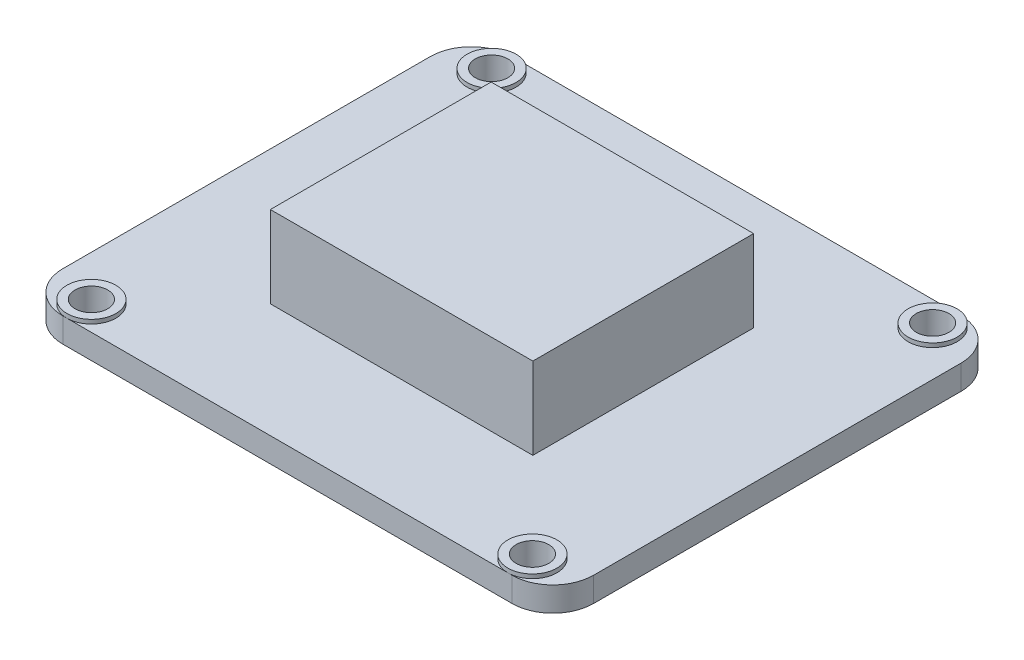
ISO-10303-21;
HEADER;
FILE_DESCRIPTION(('STEP AP214'),'2;1');
FILE_NAME('part.step','',(''),(''),'','','');
FILE_SCHEMA(('AUTOMOTIVE_DESIGN { 1 0 10303 214 1 1 1 1 }'));
ENDSEC;
DATA;
#1=APPLICATION_CONTEXT('core data for automotive mechanical design processes');
#2=APPLICATION_PROTOCOL_DEFINITION('international standard','automotive_design',2000,#1);
#3=PRODUCT_CONTEXT('',#1,'mechanical');
#4=PRODUCT('Part','Part','',(#3));
#5=PRODUCT_RELATED_PRODUCT_CATEGORY('part','',(#4));
#6=PRODUCT_DEFINITION_FORMATION('','',#4);
#7=PRODUCT_DEFINITION_CONTEXT('part definition',#1,'design');
#8=PRODUCT_DEFINITION('design','',#6,#7);
#9=PRODUCT_DEFINITION_SHAPE('','',#8);
#10=(LENGTH_UNIT() NAMED_UNIT(*) SI_UNIT(.MILLI.,.METRE.));
#11=(NAMED_UNIT(*) PLANE_ANGLE_UNIT() SI_UNIT($,.RADIAN.));
#12=(NAMED_UNIT(*) SI_UNIT($,.STERADIAN.) SOLID_ANGLE_UNIT());
#13=UNCERTAINTY_MEASURE_WITH_UNIT(LENGTH_MEASURE(1.E-05),#10,'distance_accuracy_value','');
#14=(GEOMETRIC_REPRESENTATION_CONTEXT(3) GLOBAL_UNCERTAINTY_ASSIGNED_CONTEXT((#13)) GLOBAL_UNIT_ASSIGNED_CONTEXT((#10,
#11,#12)) REPRESENTATION_CONTEXT('',''));
#15=CARTESIAN_POINT('',(0.,0.,0.));
#16=DIRECTION('',(0.,0.,1.));
#17=DIRECTION('',(1.,0.,0.));
#18=AXIS2_PLACEMENT_3D('',#15,#16,#17);
#19=CARTESIAN_POINT('',(25.6456945536766,-3.,-23.5882343577555));
#20=DIRECTION('',(0.,1.,0.));
#21=DIRECTION('',(0.,0.,1.));
#22=AXIS2_PLACEMENT_3D('',#19,#20,#21);
#23=CYLINDRICAL_SURFACE('',#22,5.);
#24=DIRECTION('',(0.,1.,0.));
#25=VECTOR('',#24,1.);
#26=CARTESIAN_POINT('',(30.6456945536766,-3.,-23.5882343577555));
#27=LINE('',#26,#25);
#28=CARTESIAN_POINT('',(30.6456945536766,-3.,-23.5882343577555));
#29=VERTEX_POINT('',#28);
#30=CARTESIAN_POINT('',(30.6456945536766,0.,-23.5882343577555));
#31=VERTEX_POINT('',#30);
#32=EDGE_CURVE('E200',#29,#31,#27,.T.);
#33=ORIENTED_EDGE('',*,*,#32,.F.);
#34=CARTESIAN_POINT('',(25.6456945536766,-3.,-23.5882343577555));
#35=DIRECTION('',(0.,-1.,0.));
#36=DIRECTION('',(0.,0.,-1.));
#37=AXIS2_PLACEMENT_3D('',#34,#35,#36);
#38=CIRCLE('',#37,5.);
#39=CARTESIAN_POINT('',(25.6456945536766,-3.,-28.5882343577555));
#40=VERTEX_POINT('',#39);
#41=EDGE_CURVE('E206',#40,#29,#38,.T.);
#42=ORIENTED_EDGE('',*,*,#41,.F.);
#43=DIRECTION('',(0.,1.,0.));
#44=VECTOR('',#43,1.);
#45=CARTESIAN_POINT('',(25.6456945536766,-3.,-28.5882343577555));
#46=LINE('',#45,#44);
#47=CARTESIAN_POINT('',(25.6456945536766,0.,-28.5882343577555));
#48=VERTEX_POINT('',#47);
#49=EDGE_CURVE('E203',#48,#40,#46,.F.);
#50=ORIENTED_EDGE('',*,*,#49,.F.);
#51=CARTESIAN_POINT('',(25.6456945536766,0.,-23.5882343577555));
#52=DIRECTION('',(0.,-1.,0.));
#53=DIRECTION('',(0.,0.,-1.));
#54=AXIS2_PLACEMENT_3D('',#51,#52,#53);
#55=CIRCLE('',#54,5.);
#56=EDGE_CURVE('E208',#31,#48,#55,.F.);
#57=ORIENTED_EDGE('',*,*,#56,.F.);
#58=EDGE_LOOP('',(#33,#42,#50,#57));
#59=FACE_BOUND('',#58,.T.);
#60=ADVANCED_FACE('F36',(#59),#23,.T.);
#61=CARTESIAN_POINT('',(0.,10.,12.4284966634252));
#62=DIRECTION('',(0.,0.,-1.));
#63=DIRECTION('',(-1.,0.,0.));
#64=AXIS2_PLACEMENT_3D('',#61,#62,#63);
#65=PLANE('',#64);
#66=DIRECTION('',(1.,0.,0.));
#67=VECTOR('',#66,1.);
#68=CARTESIAN_POINT('',(0.,0.,12.4284966634252));
#69=LINE('',#68,#67);
#70=CARTESIAN_POINT('',(-17.9232648366275,0.,12.4284966634252));
#71=VERTEX_POINT('',#70);
#72=CARTESIAN_POINT('',(14.2146539439807,0.,12.4284966634252));
#73=VERTEX_POINT('',#72);
#74=EDGE_CURVE('E180',#71,#73,#69,.T.);
#75=ORIENTED_EDGE('',*,*,#74,.T.);
#76=DIRECTION('',(0.,-1.,0.));
#77=VECTOR('',#76,1.);
#78=CARTESIAN_POINT('',(14.2146539439807,10.,12.4284966634252));
#79=LINE('',#78,#77);
#80=CARTESIAN_POINT('',(14.2146539439807,10.,12.4284966634252));
#81=VERTEX_POINT('',#80);
#82=EDGE_CURVE('E197',#81,#73,#79,.T.);
#83=ORIENTED_EDGE('',*,*,#82,.F.);
#84=DIRECTION('',(1.,0.,0.));
#85=VECTOR('',#84,1.);
#86=CARTESIAN_POINT('',(0.,10.,12.4284966634252));
#87=LINE('',#86,#85);
#88=CARTESIAN_POINT('',(-17.9232648366275,10.,12.4284966634252));
#89=VERTEX_POINT('',#88);
#90=EDGE_CURVE('E167',#89,#81,#87,.T.);
#91=ORIENTED_EDGE('',*,*,#90,.F.);
#92=DIRECTION('',(0.,-1.,0.));
#93=VECTOR('',#92,1.);
#94=CARTESIAN_POINT('',(-17.9232648366275,10.,12.4284966634252));
#95=LINE('',#94,#93);
#96=EDGE_CURVE('E179',#89,#71,#95,.T.);
#97=ORIENTED_EDGE('',*,*,#96,.T.);
#98=EDGE_LOOP('',(#75,#83,#91,#97));
#99=FACE_BOUND('',#98,.T.);
#100=ADVANCED_FACE('F314',(#99),#65,.F.);
#101=CARTESIAN_POINT('',(14.2146539439807,10.,0.));
#102=DIRECTION('',(-1.,0.,0.));
#103=DIRECTION('',(0.,0.,1.));
#104=AXIS2_PLACEMENT_3D('',#101,#102,#103);
#105=PLANE('',#104);
#106=DIRECTION('',(0.,0.,-1.));
#107=VECTOR('',#106,1.);
#108=CARTESIAN_POINT('',(14.2146539439807,0.,0.));
#109=LINE('',#108,#107);
#110=CARTESIAN_POINT('',(14.2146539439807,0.,-14.6049653789362));
#111=VERTEX_POINT('',#110);
#112=EDGE_CURVE('E183',#73,#111,#109,.T.);
#113=ORIENTED_EDGE('',*,*,#112,.T.);
#114=DIRECTION('',(0.,-1.,0.));
#115=VECTOR('',#114,1.);
#116=CARTESIAN_POINT('',(14.2146539439807,10.,-14.6049653789362));
#117=LINE('',#116,#115);
#118=CARTESIAN_POINT('',(14.2146539439807,10.,-14.6049653789362));
#119=VERTEX_POINT('',#118);
#120=EDGE_CURVE('E194',#119,#111,#117,.T.);
#121=ORIENTED_EDGE('',*,*,#120,.F.);
#122=DIRECTION('',(0.,0.,-1.));
#123=VECTOR('',#122,1.);
#124=CARTESIAN_POINT('',(14.2146539439807,10.,0.));
#125=LINE('',#124,#123);
#126=EDGE_CURVE('E170',#81,#119,#125,.T.);
#127=ORIENTED_EDGE('',*,*,#126,.F.);
#128=ORIENTED_EDGE('',*,*,#82,.T.);
#129=EDGE_LOOP('',(#113,#121,#127,#128));
#130=FACE_BOUND('',#129,.T.);
#131=ADVANCED_FACE('F320',(#130),#105,.F.);
#132=CARTESIAN_POINT('',(0.,10.,-14.6049653789362));
#133=DIRECTION('',(0.,0.,-1.));
#134=DIRECTION('',(-1.,0.,0.));
#135=AXIS2_PLACEMENT_3D('',#132,#133,#134);
#136=PLANE('',#135);
#137=DIRECTION('',(1.,0.,0.));
#138=VECTOR('',#137,1.);
#139=CARTESIAN_POINT('',(0.,0.,-14.6049653789362));
#140=LINE('',#139,#138);
#141=CARTESIAN_POINT('',(-17.9232648366275,0.,-14.6049653789362));
#142=VERTEX_POINT('',#141);
#143=EDGE_CURVE('E186',#142,#111,#140,.T.);
#144=ORIENTED_EDGE('',*,*,#143,.F.);
#145=DIRECTION('',(0.,-1.,0.));
#146=VECTOR('',#145,1.);
#147=CARTESIAN_POINT('',(-17.9232648366275,10.,-14.6049653789362));
#148=LINE('',#147,#146);
#149=CARTESIAN_POINT('',(-17.9232648366275,10.,-14.6049653789362));
#150=VERTEX_POINT('',#149);
#151=EDGE_CURVE('E191',#150,#142,#148,.T.);
#152=ORIENTED_EDGE('',*,*,#151,.F.);
#153=DIRECTION('',(1.,0.,0.));
#154=VECTOR('',#153,1.);
#155=CARTESIAN_POINT('',(0.,10.,-14.6049653789362));
#156=LINE('',#155,#154);
#157=EDGE_CURVE('E173',#150,#119,#156,.T.);
#158=ORIENTED_EDGE('',*,*,#157,.T.);
#159=ORIENTED_EDGE('',*,*,#120,.T.);
#160=EDGE_LOOP('',(#144,#152,#158,#159));
#161=FACE_BOUND('',#160,.T.);
#162=ADVANCED_FACE('F411',(#161),#136,.T.);
#163=CARTESIAN_POINT('',(-17.9232648366275,10.,0.));
#164=DIRECTION('',(-1.,0.,0.));
#165=DIRECTION('',(0.,0.,1.));
#166=AXIS2_PLACEMENT_3D('',#163,#164,#165);
#167=PLANE('',#166);
#168=DIRECTION('',(0.,0.,-1.));
#169=VECTOR('',#168,1.);
#170=CARTESIAN_POINT('',(-17.9232648366275,0.,0.));
#171=LINE('',#170,#169);
#172=EDGE_CURVE('E171',#71,#142,#171,.T.);
#173=ORIENTED_EDGE('',*,*,#172,.F.);
#174=ORIENTED_EDGE('',*,*,#96,.F.);
#175=DIRECTION('',(0.,0.,-1.));
#176=VECTOR('',#175,1.);
#177=CARTESIAN_POINT('',(-17.9232648366275,10.,0.));
#178=LINE('',#177,#176);
#179=EDGE_CURVE('E176',#89,#150,#178,.T.);
#180=ORIENTED_EDGE('',*,*,#179,.T.);
#181=ORIENTED_EDGE('',*,*,#151,.T.);
#182=EDGE_LOOP('',(#173,#174,#180,#181));
#183=FACE_BOUND('',#182,.T.);
#184=ADVANCED_FACE('F407',(#183),#167,.T.);
#185=CARTESIAN_POINT('',(0.,10.,0.));
#186=DIRECTION('',(0.,1.,0.));
#187=DIRECTION('',(0.,0.,1.));
#188=AXIS2_PLACEMENT_3D('',#185,#186,#187);
#189=PLANE('',#188);
#190=ORIENTED_EDGE('',*,*,#90,.T.);
#191=ORIENTED_EDGE('',*,*,#126,.T.);
#192=ORIENTED_EDGE('',*,*,#157,.F.);
#193=ORIENTED_EDGE('',*,*,#179,.F.);
#194=EDGE_LOOP('',(#190,#191,#192,#193));
#195=FACE_BOUND('',#194,.T.);
#196=ADVANCED_FACE('F404',(#195),#189,.T.);
#197=CARTESIAN_POINT('',(-34.3543054463234,-3.,-28.5882343577555));
#198=DIRECTION('',(0.,0.,1.));
#199=DIRECTION('',(1.,0.,0.));
#200=AXIS2_PLACEMENT_3D('',#197,#198,#199);
#201=PLANE('',#200);
#202=DIRECTION('',(1.,0.,0.));
#203=VECTOR('',#202,1.);
#204=CARTESIAN_POINT('',(-34.3543054463234,-3.,-28.5882343577555));
#205=LINE('',#204,#203);
#206=CARTESIAN_POINT('',(-29.3543054463234,-3.,-28.5882343577555));
#207=VERTEX_POINT('',#206);
#208=EDGE_CURVE('E166',#207,#40,#205,.T.);
#209=ORIENTED_EDGE('',*,*,#208,.F.);
#210=DIRECTION('',(0.,1.,0.));
#211=VECTOR('',#210,1.);
#212=CARTESIAN_POINT('',(-29.3543054463234,0.,-28.5882343577555));
#213=LINE('',#212,#211);
#214=CARTESIAN_POINT('',(-29.3543054463234,0.,-28.5882343577555));
#215=VERTEX_POINT('',#214);
#216=EDGE_CURVE('E142',#207,#215,#213,.T.);
#217=ORIENTED_EDGE('',*,*,#216,.T.);
#218=DIRECTION('',(1.,0.,0.));
#219=VECTOR('',#218,1.);
#220=CARTESIAN_POINT('',(-34.3543054463234,0.,-28.5882343577555));
#221=LINE('',#220,#219);
#222=CARTESIAN_POINT('',(-28.8543054463234,0.,-28.5882343577555));
#223=VERTEX_POINT('',#222);
#224=EDGE_CURVE('E134',#215,#223,#221,.T.);
#225=ORIENTED_EDGE('',*,*,#224,.T.);
#226=CARTESIAN_POINT('',(25.1456945536766,0.,-28.5882343577555));
#227=VERTEX_POINT('',#226);
#228=EDGE_CURVE('E139',#223,#227,#221,.T.);
#229=ORIENTED_EDGE('',*,*,#228,.T.);
#230=EDGE_CURVE('E146',#227,#48,#221,.T.);
#231=ORIENTED_EDGE('',*,*,#230,.T.);
#232=ORIENTED_EDGE('',*,*,#49,.T.);
#233=EDGE_LOOP('',(#209,#217,#225,#229,#231,#232));
#234=FACE_BOUND('',#233,.T.);
#235=ADVANCED_FACE('F137',(#234),#201,.F.);
#236=CARTESIAN_POINT('',(30.6456945536766,-3.,-28.5882343577555));
#237=DIRECTION('',(-1.,0.,0.));
#238=DIRECTION('',(0.,0.,1.));
#239=AXIS2_PLACEMENT_3D('',#236,#237,#238);
#240=PLANE('',#239);
#241=DIRECTION('',(0.,0.,1.));
#242=VECTOR('',#241,1.);
#243=CARTESIAN_POINT('',(30.6456945536766,0.,-28.5882343577555));
#244=LINE('',#243,#242);
#245=CARTESIAN_POINT('',(30.6456945536766,0.,21.4117656422445));
#246=VERTEX_POINT('',#245);
#247=EDGE_CURVE('E144',#31,#246,#244,.T.);
#248=ORIENTED_EDGE('',*,*,#247,.T.);
#249=DIRECTION('',(0.,1.,0.));
#250=VECTOR('',#249,1.);
#251=CARTESIAN_POINT('',(30.6456945536766,-3.,21.4117656422445));
#252=LINE('',#251,#250);
#253=CARTESIAN_POINT('',(30.6456945536766,-3.,21.4117656422445));
#254=VERTEX_POINT('',#253);
#255=EDGE_CURVE('E215',#246,#254,#252,.F.);
#256=ORIENTED_EDGE('',*,*,#255,.T.);
#257=DIRECTION('',(0.,0.,1.));
#258=VECTOR('',#257,1.);
#259=CARTESIAN_POINT('',(30.6456945536766,-3.,-28.5882343577555));
#260=LINE('',#259,#258);
#261=EDGE_CURVE('E243',#29,#254,#260,.T.);
#262=ORIENTED_EDGE('',*,*,#261,.F.);
#263=ORIENTED_EDGE('',*,*,#32,.T.);
#264=EDGE_LOOP('',(#248,#256,#262,#263));
#265=FACE_BOUND('',#264,.T.);
#266=ADVANCED_FACE('F399',(#265),#240,.F.);
#267=CARTESIAN_POINT('',(-34.3543054463234,-3.,26.4117656422445));
#268=DIRECTION('',(0.,0.,1.));
#269=DIRECTION('',(1.,0.,0.));
#270=AXIS2_PLACEMENT_3D('',#267,#268,#269);
#271=PLANE('',#270);
#272=DIRECTION('',(1.,0.,0.));
#273=VECTOR('',#272,1.);
#274=CARTESIAN_POINT('',(-34.3543054463234,0.,26.4117656422445));
#275=LINE('',#274,#273);
#276=CARTESIAN_POINT('',(-29.3543054463234,0.,26.4117656422445));
#277=VERTEX_POINT('',#276);
#278=CARTESIAN_POINT('',(-28.8543054463234,0.,26.4117656422445));
#279=VERTEX_POINT('',#278);
#280=EDGE_CURVE('E161',#277,#279,#275,.T.);
#281=ORIENTED_EDGE('',*,*,#280,.F.);
#282=DIRECTION('',(0.,1.,0.));
#283=VECTOR('',#282,1.);
#284=CARTESIAN_POINT('',(-29.3543054463234,-3.,26.4117656422445));
#285=LINE('',#284,#283);
#286=CARTESIAN_POINT('',(-29.3543054463234,-3.,26.4117656422445));
#287=VERTEX_POINT('',#286);
#288=EDGE_CURVE('E225',#277,#287,#285,.F.);
#289=ORIENTED_EDGE('',*,*,#288,.T.);
#290=DIRECTION('',(1.,0.,0.));
#291=VECTOR('',#290,1.);
#292=CARTESIAN_POINT('',(-34.3543054463234,-3.,26.4117656422445));
#293=LINE('',#292,#291);
#294=CARTESIAN_POINT('',(25.6456945536766,-3.,26.4117656422445));
#295=VERTEX_POINT('',#294);
#296=EDGE_CURVE('E237',#287,#295,#293,.T.);
#297=ORIENTED_EDGE('',*,*,#296,.T.);
#298=DIRECTION('',(0.,1.,0.));
#299=VECTOR('',#298,1.);
#300=CARTESIAN_POINT('',(25.6456945536766,0.,26.4117656422445));
#301=LINE('',#300,#299);
#302=CARTESIAN_POINT('',(25.6456945536766,0.,26.4117656422445));
#303=VERTEX_POINT('',#302);
#304=EDGE_CURVE('E210',#295,#303,#301,.T.);
#305=ORIENTED_EDGE('',*,*,#304,.T.);
#306=CARTESIAN_POINT('',(25.1456945536766,0.,26.4117656422445));
#307=VERTEX_POINT('',#306);
#308=EDGE_CURVE('E160',#307,#303,#275,.T.);
#309=ORIENTED_EDGE('',*,*,#308,.F.);
#310=EDGE_CURVE('E164',#279,#307,#275,.T.);
#311=ORIENTED_EDGE('',*,*,#310,.F.);
#312=EDGE_LOOP('',(#281,#289,#297,#305,#309,#311));
#313=FACE_BOUND('',#312,.T.);
#314=ADVANCED_FACE('F345',(#313),#271,.T.);
#315=CARTESIAN_POINT('',(-34.3543054463234,-3.,-28.5882343577555));
#316=DIRECTION('',(-1.,0.,0.));
#317=DIRECTION('',(0.,0.,1.));
#318=AXIS2_PLACEMENT_3D('',#315,#316,#317);
#319=PLANE('',#318);
#320=DIRECTION('',(0.,0.,1.));
#321=VECTOR('',#320,1.);
#322=CARTESIAN_POINT('',(-34.3543054463234,0.,-28.5882343577555));
#323=LINE('',#322,#321);
#324=CARTESIAN_POINT('',(-34.3543054463234,0.,-23.5882343577555));
#325=VERTEX_POINT('',#324);
#326=CARTESIAN_POINT('',(-34.3543054463234,0.,21.4117656422445));
#327=VERTEX_POINT('',#326);
#328=EDGE_CURVE('E163',#325,#327,#323,.T.);
#329=ORIENTED_EDGE('',*,*,#328,.F.);
#330=DIRECTION('',(0.,1.,0.));
#331=VECTOR('',#330,1.);
#332=CARTESIAN_POINT('',(-34.3543054463234,-3.,-23.5882343577555));
#333=LINE('',#332,#331);
#334=CARTESIAN_POINT('',(-34.3543054463234,-3.,-23.5882343577555));
#335=VERTEX_POINT('',#334);
#336=EDGE_CURVE('E44',#325,#335,#333,.F.);
#337=ORIENTED_EDGE('',*,*,#336,.T.);
#338=DIRECTION('',(0.,0.,1.));
#339=VECTOR('',#338,1.);
#340=CARTESIAN_POINT('',(-34.3543054463234,-3.,-28.5882343577555));
#341=LINE('',#340,#339);
#342=CARTESIAN_POINT('',(-34.3543054463234,-3.,21.4117656422445));
#343=VERTEX_POINT('',#342);
#344=EDGE_CURVE('E156',#335,#343,#341,.T.);
#345=ORIENTED_EDGE('',*,*,#344,.T.);
#346=DIRECTION('',(0.,1.,0.));
#347=VECTOR('',#346,1.);
#348=CARTESIAN_POINT('',(-34.3543054463234,-3.,21.4117656422445));
#349=LINE('',#348,#347);
#350=EDGE_CURVE('E220',#343,#327,#349,.T.);
#351=ORIENTED_EDGE('',*,*,#350,.T.);
#352=EDGE_LOOP('',(#329,#337,#345,#351));
#353=FACE_BOUND('',#352,.T.);
#354=ADVANCED_FACE('F242',(#353),#319,.T.);
#355=CARTESIAN_POINT('',(0.,-3.,0.));
#356=DIRECTION('',(0.,-1.,0.));
#357=DIRECTION('',(0.,0.,-1.));
#358=AXIS2_PLACEMENT_3D('',#355,#356,#357);
#359=PLANE('',#358);
#360=CARTESIAN_POINT('',(-28.8543054463234,-3.,-25.5882343577555));
#361=DIRECTION('',(0.,1.,0.));
#362=DIRECTION('',(0.,0.,1.));
#363=AXIS2_PLACEMENT_3D('',#360,#361,#362);
#364=CIRCLE('',#363,2.);
#365=CARTESIAN_POINT('',(-28.8543054463234,-3.,-23.5882343577555));
#366=VERTEX_POINT('',#365);
#367=EDGE_CURVE('E257',#366,#366,#364,.T.);
#368=ORIENTED_EDGE('',*,*,#367,.T.);
#369=EDGE_LOOP('',(#368));
#370=FACE_BOUND('',#369,.T.);
#371=CARTESIAN_POINT('',(25.1456945536766,-3.,-25.5882343577555));
#372=DIRECTION('',(0.,1.,0.));
#373=DIRECTION('',(0.,0.,1.));
#374=AXIS2_PLACEMENT_3D('',#371,#372,#373);
#375=CIRCLE('',#374,2.);
#376=CARTESIAN_POINT('',(25.1456945536766,-3.,-23.5882343577555));
#377=VERTEX_POINT('',#376);
#378=EDGE_CURVE('E254',#377,#377,#375,.T.);
#379=ORIENTED_EDGE('',*,*,#378,.T.);
#380=EDGE_LOOP('',(#379));
#381=FACE_BOUND('',#380,.T.);
#382=CARTESIAN_POINT('',(-28.8543054463234,-3.,23.4117656422445));
#383=DIRECTION('',(0.,1.,0.));
#384=DIRECTION('',(0.,0.,1.));
#385=AXIS2_PLACEMENT_3D('',#382,#383,#384);
#386=CIRCLE('',#385,2.);
#387=CARTESIAN_POINT('',(-28.8543054463234,-3.,25.4117656422445));
#388=VERTEX_POINT('',#387);
#389=EDGE_CURVE('E251',#388,#388,#386,.T.);
#390=ORIENTED_EDGE('',*,*,#389,.T.);
#391=EDGE_LOOP('',(#390));
#392=FACE_BOUND('',#391,.T.);
#393=CARTESIAN_POINT('',(25.1456945536766,-3.,23.4117656422445));
#394=DIRECTION('',(0.,1.,0.));
#395=DIRECTION('',(0.,0.,1.));
#396=AXIS2_PLACEMENT_3D('',#393,#394,#395);
#397=CIRCLE('',#396,2.);
#398=CARTESIAN_POINT('',(25.1456945536766,-3.,25.4117656422445));
#399=VERTEX_POINT('',#398);
#400=EDGE_CURVE('E153',#399,#399,#397,.T.);
#401=ORIENTED_EDGE('',*,*,#400,.T.);
#402=EDGE_LOOP('',(#401));
#403=FACE_BOUND('',#402,.T.);
#404=ORIENTED_EDGE('',*,*,#344,.F.);
#405=CARTESIAN_POINT('',(-29.3543054463234,-3.,-23.5882343577555));
#406=DIRECTION('',(0.,-1.,0.));
#407=DIRECTION('',(0.,0.,-1.));
#408=AXIS2_PLACEMENT_3D('',#405,#406,#407);
#409=CIRCLE('',#408,5.);
#410=EDGE_CURVE('E11',#335,#207,#409,.T.);
#411=ORIENTED_EDGE('',*,*,#410,.T.);
#412=ORIENTED_EDGE('',*,*,#208,.T.);
#413=ORIENTED_EDGE('',*,*,#41,.T.);
#414=ORIENTED_EDGE('',*,*,#261,.T.);
#415=CARTESIAN_POINT('',(25.6456945536766,-3.,21.4117656422445));
#416=DIRECTION('',(0.,-1.,0.));
#417=DIRECTION('',(0.,0.,-1.));
#418=AXIS2_PLACEMENT_3D('',#415,#416,#417);
#419=CIRCLE('',#418,5.);
#420=EDGE_CURVE('E217',#254,#295,#419,.T.);
#421=ORIENTED_EDGE('',*,*,#420,.T.);
#422=ORIENTED_EDGE('',*,*,#296,.F.);
#423=CARTESIAN_POINT('',(-29.3543054463234,-3.,21.4117656422445));
#424=DIRECTION('',(0.,-1.,0.));
#425=DIRECTION('',(0.,0.,-1.));
#426=AXIS2_PLACEMENT_3D('',#423,#424,#425);
#427=CIRCLE('',#426,5.);
#428=EDGE_CURVE('E227',#287,#343,#427,.T.);
#429=ORIENTED_EDGE('',*,*,#428,.T.);
#430=EDGE_LOOP('',(#404,#411,#412,#413,#414,#421,#422,#429));
#431=FACE_BOUND('',#430,.T.);
#432=ADVANCED_FACE('F235',(#370,#381,#392,#403,#431),#359,.T.);
#433=CARTESIAN_POINT('',(0.,0.,0.));
#434=DIRECTION('',(0.,-1.,0.));
#435=DIRECTION('',(0.,0.,-1.));
#436=AXIS2_PLACEMENT_3D('',#433,#434,#435);
#437=PLANE('',#436);
#438=ORIENTED_EDGE('',*,*,#74,.F.);
#439=ORIENTED_EDGE('',*,*,#172,.T.);
#440=ORIENTED_EDGE('',*,*,#143,.T.);
#441=ORIENTED_EDGE('',*,*,#112,.F.);
#442=EDGE_LOOP('',(#438,#439,#440,#441));
#443=FACE_BOUND('',#442,.T.);
#444=ORIENTED_EDGE('',*,*,#224,.F.);
#445=CARTESIAN_POINT('',(-29.3543054463234,0.,-23.5882343577555));
#446=DIRECTION('',(0.,-1.,0.));
#447=DIRECTION('',(0.,0.,-1.));
#448=AXIS2_PLACEMENT_3D('',#445,#446,#447);
#449=CIRCLE('',#448,5.);
#450=EDGE_CURVE('E58',#215,#325,#449,.F.);
#451=ORIENTED_EDGE('',*,*,#450,.T.);
#452=ORIENTED_EDGE('',*,*,#328,.T.);
#453=CARTESIAN_POINT('',(-29.3543054463234,0.,21.4117656422445));
#454=DIRECTION('',(0.,-1.,0.));
#455=DIRECTION('',(0.,0.,-1.));
#456=AXIS2_PLACEMENT_3D('',#453,#454,#455);
#457=CIRCLE('',#456,5.);
#458=EDGE_CURVE('E223',#327,#277,#457,.F.);
#459=ORIENTED_EDGE('',*,*,#458,.T.);
#460=ORIENTED_EDGE('',*,*,#280,.T.);
#461=CARTESIAN_POINT('',(-28.8543054463234,0.,23.4117656422445));
#462=DIRECTION('',(0.,1.,0.));
#463=DIRECTION('',(0.,0.,1.));
#464=AXIS2_PLACEMENT_3D('',#461,#462,#463);
#465=CIRCLE('',#464,3.);
#466=EDGE_CURVE('E277',#279,#279,#465,.T.);
#467=ORIENTED_EDGE('',*,*,#466,.F.);
#468=ORIENTED_EDGE('',*,*,#310,.T.);
#469=CARTESIAN_POINT('',(25.1456945536766,0.,23.4117656422445));
#470=DIRECTION('',(0.,1.,0.));
#471=DIRECTION('',(0.,0.,1.));
#472=AXIS2_PLACEMENT_3D('',#469,#470,#471);
#473=CIRCLE('',#472,3.);
#474=EDGE_CURVE('E268',#307,#307,#473,.T.);
#475=ORIENTED_EDGE('',*,*,#474,.F.);
#476=ORIENTED_EDGE('',*,*,#308,.T.);
#477=CARTESIAN_POINT('',(25.6456945536766,0.,21.4117656422445));
#478=DIRECTION('',(0.,-1.,0.));
#479=DIRECTION('',(0.,0.,-1.));
#480=AXIS2_PLACEMENT_3D('',#477,#478,#479);
#481=CIRCLE('',#480,5.);
#482=EDGE_CURVE('E213',#303,#246,#481,.F.);
#483=ORIENTED_EDGE('',*,*,#482,.T.);
#484=ORIENTED_EDGE('',*,*,#247,.F.);
#485=ORIENTED_EDGE('',*,*,#56,.T.);
#486=ORIENTED_EDGE('',*,*,#230,.F.);
#487=CARTESIAN_POINT('',(25.1456945536766,0.,-25.5882343577555));
#488=DIRECTION('',(0.,1.,0.));
#489=DIRECTION('',(0.,0.,1.));
#490=AXIS2_PLACEMENT_3D('',#487,#488,#489);
#491=CIRCLE('',#490,2.99999999999999);
#492=EDGE_CURVE('E152',#227,#227,#491,.T.);
#493=ORIENTED_EDGE('',*,*,#492,.F.);
#494=ORIENTED_EDGE('',*,*,#228,.F.);
#495=CARTESIAN_POINT('',(-28.8543054463234,0.,-25.5882343577555));
#496=DIRECTION('',(0.,1.,0.));
#497=DIRECTION('',(0.,0.,1.));
#498=AXIS2_PLACEMENT_3D('',#495,#496,#497);
#499=CIRCLE('',#498,3.);
#500=EDGE_CURVE('E150',#223,#223,#499,.T.);
#501=ORIENTED_EDGE('',*,*,#500,.F.);
#502=EDGE_LOOP('',(#444,#451,#452,#459,#460,#467,#468,#475,#476,#483,#484,#485,#486,#493,#494,#501));
#503=FACE_BOUND('',#502,.T.);
#504=ADVANCED_FACE('F148',(#443,#503),#437,.F.);
#505=CARTESIAN_POINT('',(25.1456945536766,-3.,23.4117656422445));
#506=DIRECTION('',(0.,1.,0.));
#507=DIRECTION('',(0.,0.,1.));
#508=AXIS2_PLACEMENT_3D('',#505,#506,#507);
#509=CYLINDRICAL_SURFACE('',#508,2.);
#510=ORIENTED_EDGE('',*,*,#400,.F.);
#511=EDGE_LOOP('',(#510));
#512=FACE_BOUND('',#511,.T.);
#513=CARTESIAN_POINT('',(25.1456945536766,0.5,23.4117656422445));
#514=DIRECTION('',(0.,1.,0.));
#515=DIRECTION('',(0.,0.,1.));
#516=AXIS2_PLACEMENT_3D('',#513,#514,#515);
#517=CIRCLE('',#516,2.);
#518=CARTESIAN_POINT('',(25.1456945536766,0.5,25.4117656422445));
#519=VERTEX_POINT('',#518);
#520=EDGE_CURVE('E271',#519,#519,#517,.T.);
#521=ORIENTED_EDGE('',*,*,#520,.T.);
#522=EDGE_LOOP('',(#521));
#523=FACE_BOUND('',#522,.T.);
#524=ADVANCED_FACE('F384',(#512,#523),#509,.F.);
#525=CARTESIAN_POINT('',(-28.8543054463234,-3.,23.4117656422445));
#526=DIRECTION('',(0.,1.,0.));
#527=DIRECTION('',(0.,0.,1.));
#528=AXIS2_PLACEMENT_3D('',#525,#526,#527);
#529=CYLINDRICAL_SURFACE('',#528,2.);
#530=ORIENTED_EDGE('',*,*,#389,.F.);
#531=EDGE_LOOP('',(#530));
#532=FACE_BOUND('',#531,.T.);
#533=CARTESIAN_POINT('',(-28.8543054463234,0.5,23.4117656422445));
#534=DIRECTION('',(0.,1.,0.));
#535=DIRECTION('',(0.,0.,1.));
#536=AXIS2_PLACEMENT_3D('',#533,#534,#535);
#537=CIRCLE('',#536,2.);
#538=CARTESIAN_POINT('',(-28.8543054463234,0.5,25.4117656422445));
#539=VERTEX_POINT('',#538);
#540=EDGE_CURVE('E280',#539,#539,#537,.T.);
#541=ORIENTED_EDGE('',*,*,#540,.T.);
#542=EDGE_LOOP('',(#541));
#543=FACE_BOUND('',#542,.T.);
#544=ADVANCED_FACE('F380',(#532,#543),#529,.F.);
#545=CARTESIAN_POINT('',(25.1456945536766,-3.,-25.5882343577555));
#546=DIRECTION('',(0.,1.,0.));
#547=DIRECTION('',(0.,0.,1.));
#548=AXIS2_PLACEMENT_3D('',#545,#546,#547);
#549=CYLINDRICAL_SURFACE('',#548,2.);
#550=ORIENTED_EDGE('',*,*,#378,.F.);
#551=EDGE_LOOP('',(#550));
#552=FACE_BOUND('',#551,.T.);
#553=CARTESIAN_POINT('',(25.1456945536766,0.5,-25.5882343577555));
#554=DIRECTION('',(0.,1.,0.));
#555=DIRECTION('',(0.,0.,1.));
#556=AXIS2_PLACEMENT_3D('',#553,#554,#555);
#557=CIRCLE('',#556,2.);
#558=CARTESIAN_POINT('',(25.1456945536766,0.5,-23.5882343577555));
#559=VERTEX_POINT('',#558);
#560=EDGE_CURVE('E262',#559,#559,#557,.T.);
#561=ORIENTED_EDGE('',*,*,#560,.T.);
#562=EDGE_LOOP('',(#561));
#563=FACE_BOUND('',#562,.T.);
#564=ADVANCED_FACE('F376',(#552,#563),#549,.F.);
#565=CARTESIAN_POINT('',(-28.8543054463234,-3.,-25.5882343577555));
#566=DIRECTION('',(0.,1.,0.));
#567=DIRECTION('',(0.,0.,1.));
#568=AXIS2_PLACEMENT_3D('',#565,#566,#567);
#569=CYLINDRICAL_SURFACE('',#568,2.);
#570=ORIENTED_EDGE('',*,*,#367,.F.);
#571=EDGE_LOOP('',(#570));
#572=FACE_BOUND('',#571,.T.);
#573=CARTESIAN_POINT('',(-28.8543054463234,0.5,-25.5882343577555));
#574=DIRECTION('',(0.,1.,0.));
#575=DIRECTION('',(0.,0.,1.));
#576=AXIS2_PLACEMENT_3D('',#573,#574,#575);
#577=CIRCLE('',#576,2.);
#578=CARTESIAN_POINT('',(-28.8543054463234,0.5,-23.5882343577555));
#579=VERTEX_POINT('',#578);
#580=EDGE_CURVE('E287',#579,#579,#577,.T.);
#581=ORIENTED_EDGE('',*,*,#580,.T.);
#582=EDGE_LOOP('',(#581));
#583=FACE_BOUND('',#582,.T.);
#584=ADVANCED_FACE('F293',(#572,#583),#569,.F.);
#585=CARTESIAN_POINT('',(25.1456945536766,0.5,-25.5882343577555));
#586=DIRECTION('',(0.,-1.,0.));
#587=DIRECTION('',(0.,0.,-1.));
#588=AXIS2_PLACEMENT_3D('',#585,#586,#587);
#589=CYLINDRICAL_SURFACE('',#588,2.99999999999999);
#590=CARTESIAN_POINT('',(25.1456945536766,0.5,-25.5882343577555));
#591=DIRECTION('',(0.,1.,0.));
#592=DIRECTION('',(0.,0.,1.));
#593=AXIS2_PLACEMENT_3D('',#590,#591,#592);
#594=CIRCLE('',#593,2.99999999999999);
#595=CARTESIAN_POINT('',(25.1456945536766,0.5,-22.5882343577555));
#596=VERTEX_POINT('',#595);
#597=EDGE_CURVE('E260',#596,#596,#594,.T.);
#598=ORIENTED_EDGE('',*,*,#597,.F.);
#599=EDGE_LOOP('',(#598));
#600=FACE_BOUND('',#599,.T.);
#601=ORIENTED_EDGE('',*,*,#492,.T.);
#602=EDGE_LOOP('',(#601));
#603=FACE_BOUND('',#602,.T.);
#604=ADVANCED_FACE('F369',(#600,#603),#589,.T.);
#605=CARTESIAN_POINT('',(0.,0.5,0.));
#606=DIRECTION('',(0.,1.,0.));
#607=DIRECTION('',(0.,0.,1.));
#608=AXIS2_PLACEMENT_3D('',#605,#606,#607);
#609=PLANE('',#608);
#610=ORIENTED_EDGE('',*,*,#560,.F.);
#611=EDGE_LOOP('',(#610));
#612=FACE_BOUND('',#611,.T.);
#613=ORIENTED_EDGE('',*,*,#597,.T.);
#614=EDGE_LOOP('',(#613));
#615=FACE_BOUND('',#614,.T.);
#616=ADVANCED_FACE('F365',(#612,#615),#609,.T.);
#617=CARTESIAN_POINT('',(25.1456945536766,0.5,23.4117656422445));
#618=DIRECTION('',(0.,-1.,0.));
#619=DIRECTION('',(0.,0.,-1.));
#620=AXIS2_PLACEMENT_3D('',#617,#618,#619);
#621=CYLINDRICAL_SURFACE('',#620,3.);
#622=CARTESIAN_POINT('',(25.1456945536766,0.5,23.4117656422445));
#623=DIRECTION('',(0.,1.,0.));
#624=DIRECTION('',(0.,0.,1.));
#625=AXIS2_PLACEMENT_3D('',#622,#623,#624);
#626=CIRCLE('',#625,3.);
#627=CARTESIAN_POINT('',(25.1456945536766,0.5,26.4117656422445));
#628=VERTEX_POINT('',#627);
#629=EDGE_CURVE('E263',#628,#628,#626,.T.);
#630=ORIENTED_EDGE('',*,*,#629,.F.);
#631=EDGE_LOOP('',(#630));
#632=FACE_BOUND('',#631,.T.);
#633=ORIENTED_EDGE('',*,*,#474,.T.);
#634=EDGE_LOOP('',(#633));
#635=FACE_BOUND('',#634,.T.);
#636=ADVANCED_FACE('F358',(#632,#635),#621,.T.);
#637=CARTESIAN_POINT('',(0.,0.5,0.));
#638=DIRECTION('',(0.,1.,0.));
#639=DIRECTION('',(0.,0.,1.));
#640=AXIS2_PLACEMENT_3D('',#637,#638,#639);
#641=PLANE('',#640);
#642=ORIENTED_EDGE('',*,*,#520,.F.);
#643=EDGE_LOOP('',(#642));
#644=FACE_BOUND('',#643,.T.);
#645=ORIENTED_EDGE('',*,*,#629,.T.);
#646=EDGE_LOOP('',(#645));
#647=FACE_BOUND('',#646,.T.);
#648=ADVANCED_FACE('F352',(#644,#647),#641,.T.);
#649=CARTESIAN_POINT('',(-28.8543054463234,0.5,23.4117656422445));
#650=DIRECTION('',(0.,-1.,0.));
#651=DIRECTION('',(0.,0.,-1.));
#652=AXIS2_PLACEMENT_3D('',#649,#650,#651);
#653=CYLINDRICAL_SURFACE('',#652,3.);
#654=CARTESIAN_POINT('',(-28.8543054463234,0.5,23.4117656422445));
#655=DIRECTION('',(0.,1.,0.));
#656=DIRECTION('',(0.,0.,1.));
#657=AXIS2_PLACEMENT_3D('',#654,#655,#656);
#658=CIRCLE('',#657,3.);
#659=CARTESIAN_POINT('',(-28.8543054463234,0.5,26.4117656422445));
#660=VERTEX_POINT('',#659);
#661=EDGE_CURVE('E272',#660,#660,#658,.T.);
#662=ORIENTED_EDGE('',*,*,#661,.F.);
#663=EDGE_LOOP('',(#662));
#664=FACE_BOUND('',#663,.T.);
#665=ORIENTED_EDGE('',*,*,#466,.T.);
#666=EDGE_LOOP('',(#665));
#667=FACE_BOUND('',#666,.T.);
#668=ADVANCED_FACE('F310',(#664,#667),#653,.T.);
#669=CARTESIAN_POINT('',(0.,0.5,0.));
#670=DIRECTION('',(0.,1.,0.));
#671=DIRECTION('',(0.,0.,1.));
#672=AXIS2_PLACEMENT_3D('',#669,#670,#671);
#673=PLANE('',#672);
#674=ORIENTED_EDGE('',*,*,#540,.F.);
#675=EDGE_LOOP('',(#674));
#676=FACE_BOUND('',#675,.T.);
#677=ORIENTED_EDGE('',*,*,#661,.T.);
#678=EDGE_LOOP('',(#677));
#679=FACE_BOUND('',#678,.T.);
#680=ADVANCED_FACE('F305',(#676,#679),#673,.T.);
#681=CARTESIAN_POINT('',(-28.8543054463234,0.5,-25.5882343577555));
#682=DIRECTION('',(0.,-1.,0.));
#683=DIRECTION('',(0.,0.,-1.));
#684=AXIS2_PLACEMENT_3D('',#681,#682,#683);
#685=CYLINDRICAL_SURFACE('',#684,3.);
#686=CARTESIAN_POINT('',(-28.8543054463234,0.5,-25.5882343577555));
#687=DIRECTION('',(0.,1.,0.));
#688=DIRECTION('',(0.,0.,1.));
#689=AXIS2_PLACEMENT_3D('',#686,#687,#688);
#690=CIRCLE('',#689,3.);
#691=CARTESIAN_POINT('',(-28.8543054463234,0.5,-22.5882343577555));
#692=VERTEX_POINT('',#691);
#693=EDGE_CURVE('E281',#692,#692,#690,.T.);
#694=ORIENTED_EDGE('',*,*,#693,.F.);
#695=EDGE_LOOP('',(#694));
#696=FACE_BOUND('',#695,.T.);
#697=ORIENTED_EDGE('',*,*,#500,.T.);
#698=EDGE_LOOP('',(#697));
#699=FACE_BOUND('',#698,.T.);
#700=ADVANCED_FACE('F299',(#696,#699),#685,.T.);
#701=CARTESIAN_POINT('',(0.,0.5,0.));
#702=DIRECTION('',(0.,1.,0.));
#703=DIRECTION('',(0.,0.,1.));
#704=AXIS2_PLACEMENT_3D('',#701,#702,#703);
#705=PLANE('',#704);
#706=ORIENTED_EDGE('',*,*,#580,.F.);
#707=EDGE_LOOP('',(#706));
#708=FACE_BOUND('',#707,.T.);
#709=ORIENTED_EDGE('',*,*,#693,.T.);
#710=EDGE_LOOP('',(#709));
#711=FACE_BOUND('',#710,.T.);
#712=ADVANCED_FACE('F295',(#708,#711),#705,.T.);
#713=CARTESIAN_POINT('',(25.6456945536766,-3.,21.4117656422445));
#714=DIRECTION('',(0.,-1.,0.));
#715=DIRECTION('',(0.,0.,-1.));
#716=AXIS2_PLACEMENT_3D('',#713,#714,#715);
#717=CYLINDRICAL_SURFACE('',#716,5.);
#718=ORIENTED_EDGE('',*,*,#420,.F.);
#719=ORIENTED_EDGE('',*,*,#255,.F.);
#720=ORIENTED_EDGE('',*,*,#482,.F.);
#721=ORIENTED_EDGE('',*,*,#304,.F.);
#722=EDGE_LOOP('',(#718,#719,#720,#721));
#723=FACE_BOUND('',#722,.T.);
#724=ADVANCED_FACE('F298',(#723),#717,.T.);
#725=CARTESIAN_POINT('',(-29.3543054463234,-3.,21.4117656422445));
#726=DIRECTION('',(0.,1.,0.));
#727=DIRECTION('',(0.,0.,1.));
#728=AXIS2_PLACEMENT_3D('',#725,#726,#727);
#729=CYLINDRICAL_SURFACE('',#728,5.);
#730=ORIENTED_EDGE('',*,*,#428,.F.);
#731=ORIENTED_EDGE('',*,*,#288,.F.);
#732=ORIENTED_EDGE('',*,*,#458,.F.);
#733=ORIENTED_EDGE('',*,*,#350,.F.);
#734=EDGE_LOOP('',(#730,#731,#732,#733));
#735=FACE_BOUND('',#734,.T.);
#736=ADVANCED_FACE('F241',(#735),#729,.T.);
#737=CARTESIAN_POINT('',(-29.3543054463234,-3.,-23.5882343577555));
#738=DIRECTION('',(0.,-1.,0.));
#739=DIRECTION('',(0.,0.,-1.));
#740=AXIS2_PLACEMENT_3D('',#737,#738,#739);
#741=CYLINDRICAL_SURFACE('',#740,5.);
#742=ORIENTED_EDGE('',*,*,#410,.F.);
#743=ORIENTED_EDGE('',*,*,#336,.F.);
#744=ORIENTED_EDGE('',*,*,#450,.F.);
#745=ORIENTED_EDGE('',*,*,#216,.F.);
#746=EDGE_LOOP('',(#742,#743,#744,#745));
#747=FACE_BOUND('',#746,.T.);
#748=ADVANCED_FACE('F38',(#747),#741,.T.);
#749=CLOSED_SHELL('',(#60,#100,#131,#162,#184,#196,#235,#266,#314,#354,#432,#504,#524,#544,#564,
#584,#604,#616,#636,#648,#668,#680,#700,#712,#724,#736,#748));
#750=MANIFOLD_SOLID_BREP('B2',#749);
#751=ADVANCED_BREP_SHAPE_REPRESENTATION('',(#18,#750),#14);
#752=SHAPE_DEFINITION_REPRESENTATION(#9,#751);
ENDSEC;
END-ISO-10303-21;
